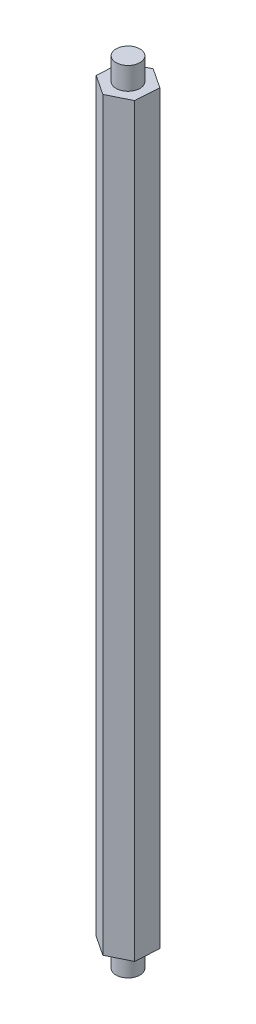
ISO-10303-21;
HEADER;
FILE_DESCRIPTION(('STEP AP214'),'2;1');
FILE_NAME('part.step','',(''),(''),'','','');
FILE_SCHEMA(('AUTOMOTIVE_DESIGN { 1 0 10303 214 1 1 1 1 }'));
ENDSEC;
DATA;
#1=APPLICATION_CONTEXT('core data for automotive mechanical design processes');
#2=APPLICATION_PROTOCOL_DEFINITION('international standard','automotive_design',2000,#1);
#3=PRODUCT_CONTEXT('',#1,'mechanical');
#4=PRODUCT('Part','Part','',(#3));
#5=PRODUCT_RELATED_PRODUCT_CATEGORY('part','',(#4));
#6=PRODUCT_DEFINITION_FORMATION('','',#4);
#7=PRODUCT_DEFINITION_CONTEXT('part definition',#1,'design');
#8=PRODUCT_DEFINITION('design','',#6,#7);
#9=PRODUCT_DEFINITION_SHAPE('','',#8);
#10=(LENGTH_UNIT() NAMED_UNIT(*) SI_UNIT(.MILLI.,.METRE.));
#11=(NAMED_UNIT(*) PLANE_ANGLE_UNIT() SI_UNIT($,.RADIAN.));
#12=(NAMED_UNIT(*) SI_UNIT($,.STERADIAN.) SOLID_ANGLE_UNIT());
#13=UNCERTAINTY_MEASURE_WITH_UNIT(LENGTH_MEASURE(1.E-05),#10,'distance_accuracy_value','');
#14=(GEOMETRIC_REPRESENTATION_CONTEXT(3) GLOBAL_UNCERTAINTY_ASSIGNED_CONTEXT((#13)) GLOBAL_UNIT_ASSIGNED_CONTEXT((#10,
#11,#12)) REPRESENTATION_CONTEXT('',''));
#15=CARTESIAN_POINT('',(0.,0.,0.));
#16=DIRECTION('',(0.,0.,1.));
#17=DIRECTION('',(1.,0.,0.));
#18=AXIS2_PLACEMENT_3D('',#15,#16,#17);
#19=CARTESIAN_POINT('',(0.,3.,0.));
#20=DIRECTION('',(0.,-1.,0.));
#21=DIRECTION('',(0.,0.,-1.));
#22=AXIS2_PLACEMENT_3D('',#19,#20,#21);
#23=CYLINDRICAL_SURFACE('',#22,1.6);
#24=CARTESIAN_POINT('',(0.,3.,0.));
#25=DIRECTION('',(0.,1.,0.));
#26=DIRECTION('',(0.,0.,1.));
#27=AXIS2_PLACEMENT_3D('',#24,#25,#26);
#28=CIRCLE('',#27,1.6);
#29=CARTESIAN_POINT('',(0.,3.,1.6));
#30=VERTEX_POINT('',#29);
#31=EDGE_CURVE('E53',#30,#30,#28,.T.);
#32=ORIENTED_EDGE('',*,*,#31,.F.);
#33=EDGE_LOOP('',(#32));
#34=FACE_BOUND('',#33,.T.);
#35=CARTESIAN_POINT('',(0.,0.,0.));
#36=DIRECTION('',(0.,1.,0.));
#37=DIRECTION('',(0.,0.,1.));
#38=AXIS2_PLACEMENT_3D('',#35,#36,#37);
#39=CIRCLE('',#38,1.6);
#40=CARTESIAN_POINT('',(0.,0.,1.6));
#41=VERTEX_POINT('',#40);
#42=EDGE_CURVE('E46',#41,#41,#39,.T.);
#43=ORIENTED_EDGE('',*,*,#42,.T.);
#44=EDGE_LOOP('',(#43));
#45=FACE_BOUND('',#44,.T.);
#46=ADVANCED_FACE('F43',(#34,#45),#23,.T.);
#47=CARTESIAN_POINT('',(0.,0.,0.));
#48=DIRECTION('',(0.,1.,0.));
#49=DIRECTION('',(0.,0.,1.));
#50=AXIS2_PLACEMENT_3D('',#47,#48,#49);
#51=PLANE('',#50);
#52=ORIENTED_EDGE('',*,*,#42,.F.);
#53=EDGE_LOOP('',(#52));
#54=FACE_BOUND('',#53,.T.);
#55=ADVANCED_FACE('F174',(#54),#51,.F.);
#56=CARTESIAN_POINT('',(-0.199155377241546,103.,3.17790120173107));
#57=DIRECTION('',(-0.44485449277717,0.,-0.895602858557278));
#58=DIRECTION('',(-0.895602858557278,0.,0.44485449277717));
#59=AXIS2_PLACEMENT_3D('',#56,#57,#58);
#60=PLANE('',#59);
#61=DIRECTION('',(0.895602858557278,0.,-0.44485449277717));
#62=VECTOR('',#61,1.);
#63=CARTESIAN_POINT('',(-0.199155377241546,3.,3.17790120173107));
#64=LINE('',#63,#62);
#65=CARTESIAN_POINT('',(-0.199155377241546,3.,3.17790120173107));
#66=VERTEX_POINT('',#65);
#67=CARTESIAN_POINT('',(2.65256548279543,3.,1.76142421685699));
#68=VERTEX_POINT('',#67);
#69=EDGE_CURVE('E135',#66,#68,#64,.T.);
#70=ORIENTED_EDGE('',*,*,#69,.T.);
#71=DIRECTION('',(0.,-1.,0.));
#72=VECTOR('',#71,1.);
#73=CARTESIAN_POINT('',(2.65256548279543,103.,1.76142421685699));
#74=LINE('',#73,#72);
#75=CARTESIAN_POINT('',(2.65256548279543,103.,1.76142421685699));
#76=VERTEX_POINT('',#75);
#77=EDGE_CURVE('E163',#76,#68,#74,.T.);
#78=ORIENTED_EDGE('',*,*,#77,.F.);
#79=DIRECTION('',(0.895602858557278,0.,-0.44485449277717));
#80=VECTOR('',#79,1.);
#81=CARTESIAN_POINT('',(-0.199155377241546,103.,3.17790120173107));
#82=LINE('',#81,#80);
#83=CARTESIAN_POINT('',(-0.199155377241546,103.,3.17790120173107));
#84=VERTEX_POINT('',#83);
#85=EDGE_CURVE('E152',#84,#76,#82,.T.);
#86=ORIENTED_EDGE('',*,*,#85,.F.);
#87=DIRECTION('',(0.,-1.,0.));
#88=VECTOR('',#87,1.);
#89=CARTESIAN_POINT('',(-0.199155377241546,103.,3.17790120173107));
#90=LINE('',#89,#88);
#91=EDGE_CURVE('E131',#84,#66,#90,.T.);
#92=ORIENTED_EDGE('',*,*,#91,.T.);
#93=EDGE_LOOP('',(#70,#78,#86,#92));
#94=FACE_BOUND('',#93,.T.);
#95=ADVANCED_FACE('F176',(#94),#60,.F.);
#96=CARTESIAN_POINT('',(2.65256548279543,103.,1.76142421685699));
#97=DIRECTION('',(-0.998042073601149,0.,-0.062546137545969));
#98=DIRECTION('',(-0.062546137545969,0.,0.998042073601149));
#99=AXIS2_PLACEMENT_3D('',#96,#97,#98);
#100=PLANE('',#99);
#101=DIRECTION('',(0.062546137545969,0.,-0.998042073601149));
#102=VECTOR('',#101,1.);
#103=CARTESIAN_POINT('',(2.65256548279543,3.,1.76142421685699));
#104=LINE('',#103,#102);
#105=CARTESIAN_POINT('',(2.85172086003698,3.,-1.41647698487408));
#106=VERTEX_POINT('',#105);
#107=EDGE_CURVE('E139',#68,#106,#104,.T.);
#108=ORIENTED_EDGE('',*,*,#107,.T.);
#109=DIRECTION('',(0.,-1.,0.));
#110=VECTOR('',#109,1.);
#111=CARTESIAN_POINT('',(2.85172086003698,103.,-1.41647698487408));
#112=LINE('',#111,#110);
#113=CARTESIAN_POINT('',(2.85172086003698,103.,-1.41647698487408));
#114=VERTEX_POINT('',#113);
#115=EDGE_CURVE('E159',#114,#106,#112,.T.);
#116=ORIENTED_EDGE('',*,*,#115,.F.);
#117=DIRECTION('',(0.062546137545969,0.,-0.998042073601149));
#118=VECTOR('',#117,1.);
#119=CARTESIAN_POINT('',(2.65256548279543,103.,1.76142421685699));
#120=LINE('',#119,#118);
#121=EDGE_CURVE('E100',#76,#114,#120,.T.);
#122=ORIENTED_EDGE('',*,*,#121,.F.);
#123=ORIENTED_EDGE('',*,*,#77,.T.);
#124=EDGE_LOOP('',(#108,#116,#122,#123));
#125=FACE_BOUND('',#124,.T.);
#126=ADVANCED_FACE('F181',(#125),#100,.F.);
#127=CARTESIAN_POINT('',(2.85172086003698,103.,-1.41647698487408));
#128=DIRECTION('',(-0.553187580823979,0.,0.833056721011309));
#129=DIRECTION('',(0.833056721011309,0.,0.553187580823979));
#130=AXIS2_PLACEMENT_3D('',#127,#128,#129);
#131=PLANE('',#130);
#132=DIRECTION('',(-0.833056721011309,0.,-0.553187580823979));
#133=VECTOR('',#132,1.);
#134=CARTESIAN_POINT('',(2.85172086003698,3.,-1.41647698487408));
#135=LINE('',#134,#133);
#136=CARTESIAN_POINT('',(0.199155377241546,3.,-3.17790120173107));
#137=VERTEX_POINT('',#136);
#138=EDGE_CURVE('E143',#106,#137,#135,.T.);
#139=ORIENTED_EDGE('',*,*,#138,.T.);
#140=DIRECTION('',(0.,-1.,0.));
#141=VECTOR('',#140,1.);
#142=CARTESIAN_POINT('',(0.199155377241546,103.,-3.17790120173107));
#143=LINE('',#142,#141);
#144=CARTESIAN_POINT('',(0.199155377241546,103.,-3.17790120173107));
#145=VERTEX_POINT('',#144);
#146=EDGE_CURVE('E124',#145,#137,#143,.T.);
#147=ORIENTED_EDGE('',*,*,#146,.F.);
#148=DIRECTION('',(-0.833056721011309,0.,-0.553187580823979));
#149=VECTOR('',#148,1.);
#150=CARTESIAN_POINT('',(2.85172086003698,103.,-1.41647698487408));
#151=LINE('',#150,#149);
#152=EDGE_CURVE('E113',#114,#145,#151,.T.);
#153=ORIENTED_EDGE('',*,*,#152,.F.);
#154=ORIENTED_EDGE('',*,*,#115,.T.);
#155=EDGE_LOOP('',(#139,#147,#153,#154));
#156=FACE_BOUND('',#155,.T.);
#157=ADVANCED_FACE('F188',(#156),#131,.F.);
#158=CARTESIAN_POINT('',(0.199155377241546,103.,-3.17790120173107));
#159=DIRECTION('',(0.444854492777169,0.,0.895602858557278));
#160=DIRECTION('',(0.895602858557278,0.,-0.444854492777169));
#161=AXIS2_PLACEMENT_3D('',#158,#159,#160);
#162=PLANE('',#161);
#163=DIRECTION('',(-0.895602858557278,0.,0.444854492777169));
#164=VECTOR('',#163,1.);
#165=CARTESIAN_POINT('',(0.199155377241546,3.,-3.17790120173107));
#166=LINE('',#165,#164);
#167=CARTESIAN_POINT('',(-2.65256548279543,3.,-1.76142421685699));
#168=VERTEX_POINT('',#167);
#169=EDGE_CURVE('E122',#137,#168,#166,.T.);
#170=ORIENTED_EDGE('',*,*,#169,.T.);
#171=DIRECTION('',(0.,-1.,0.));
#172=VECTOR('',#171,1.);
#173=CARTESIAN_POINT('',(-2.65256548279543,103.,-1.76142421685699));
#174=LINE('',#173,#172);
#175=CARTESIAN_POINT('',(-2.65256548279543,103.,-1.76142421685699));
#176=VERTEX_POINT('',#175);
#177=EDGE_CURVE('E119',#176,#168,#174,.T.);
#178=ORIENTED_EDGE('',*,*,#177,.F.);
#179=DIRECTION('',(-0.895602858557278,0.,0.444854492777169));
#180=VECTOR('',#179,1.);
#181=CARTESIAN_POINT('',(0.199155377241546,103.,-3.17790120173107));
#182=LINE('',#181,#180);
#183=EDGE_CURVE('E107',#145,#176,#182,.T.);
#184=ORIENTED_EDGE('',*,*,#183,.F.);
#185=ORIENTED_EDGE('',*,*,#146,.T.);
#186=EDGE_LOOP('',(#170,#178,#184,#185));
#187=FACE_BOUND('',#186,.T.);
#188=ADVANCED_FACE('F120',(#187),#162,.F.);
#189=CARTESIAN_POINT('',(-2.65256548279543,103.,-1.76142421685699));
#190=DIRECTION('',(0.998042073601149,0.,0.0625461375459693));
#191=DIRECTION('',(0.0625461375459693,0.,-0.998042073601149));
#192=AXIS2_PLACEMENT_3D('',#189,#190,#191);
#193=PLANE('',#192);
#194=DIRECTION('',(-0.0625461375459693,0.,0.998042073601149));
#195=VECTOR('',#194,1.);
#196=CARTESIAN_POINT('',(-2.65256548279543,3.,-1.76142421685699));
#197=LINE('',#196,#195);
#198=CARTESIAN_POINT('',(-2.85172086003698,3.,1.41647698487408));
#199=VERTEX_POINT('',#198);
#200=EDGE_CURVE('E85',#168,#199,#197,.T.);
#201=ORIENTED_EDGE('',*,*,#200,.T.);
#202=DIRECTION('',(0.,-1.,0.));
#203=VECTOR('',#202,1.);
#204=CARTESIAN_POINT('',(-2.85172086003698,103.,1.41647698487408));
#205=LINE('',#204,#203);
#206=CARTESIAN_POINT('',(-2.85172086003698,103.,1.41647698487408));
#207=VERTEX_POINT('',#206);
#208=EDGE_CURVE('E125',#207,#199,#205,.T.);
#209=ORIENTED_EDGE('',*,*,#208,.F.);
#210=DIRECTION('',(-0.0625461375459693,0.,0.998042073601149));
#211=VECTOR('',#210,1.);
#212=CARTESIAN_POINT('',(-2.65256548279543,103.,-1.76142421685699));
#213=LINE('',#212,#211);
#214=EDGE_CURVE('E111',#176,#207,#213,.T.);
#215=ORIENTED_EDGE('',*,*,#214,.F.);
#216=ORIENTED_EDGE('',*,*,#177,.T.);
#217=EDGE_LOOP('',(#201,#209,#215,#216));
#218=FACE_BOUND('',#217,.T.);
#219=ADVANCED_FACE('F127',(#218),#193,.F.);
#220=CARTESIAN_POINT('',(-2.85172086003698,103.,1.41647698487408));
#221=DIRECTION('',(0.553187580823979,0.,-0.833056721011309));
#222=DIRECTION('',(-0.833056721011309,0.,-0.553187580823979));
#223=AXIS2_PLACEMENT_3D('',#220,#221,#222);
#224=PLANE('',#223);
#225=DIRECTION('',(0.833056721011309,0.,0.553187580823979));
#226=VECTOR('',#225,1.);
#227=CARTESIAN_POINT('',(-2.85172086003698,3.,1.41647698487408));
#228=LINE('',#227,#226);
#229=EDGE_CURVE('E91',#199,#66,#228,.T.);
#230=ORIENTED_EDGE('',*,*,#229,.T.);
#231=ORIENTED_EDGE('',*,*,#91,.F.);
#232=DIRECTION('',(0.833056721011309,0.,0.553187580823979));
#233=VECTOR('',#232,1.);
#234=CARTESIAN_POINT('',(-2.85172086003698,103.,1.41647698487408));
#235=LINE('',#234,#233);
#236=EDGE_CURVE('E62',#207,#84,#235,.T.);
#237=ORIENTED_EDGE('',*,*,#236,.F.);
#238=ORIENTED_EDGE('',*,*,#208,.T.);
#239=EDGE_LOOP('',(#230,#231,#237,#238));
#240=FACE_BOUND('',#239,.T.);
#241=ADVANCED_FACE('F196',(#240),#224,.F.);
#242=CARTESIAN_POINT('',(0.,103.,0.));
#243=DIRECTION('',(0.,1.,0.));
#244=DIRECTION('',(0.,0.,1.));
#245=AXIS2_PLACEMENT_3D('',#242,#243,#244);
#246=PLANE('',#245);
#247=CARTESIAN_POINT('',(0.,103.,0.));
#248=DIRECTION('',(0.,1.,0.));
#249=DIRECTION('',(0.,0.,1.));
#250=AXIS2_PLACEMENT_3D('',#247,#248,#249);
#251=CIRCLE('',#250,1.6);
#252=CARTESIAN_POINT('',(0.,103.,1.6));
#253=VERTEX_POINT('',#252);
#254=EDGE_CURVE('E11',#253,#253,#251,.T.);
#255=ORIENTED_EDGE('',*,*,#254,.F.);
#256=EDGE_LOOP('',(#255));
#257=FACE_BOUND('',#256,.T.);
#258=ORIENTED_EDGE('',*,*,#85,.T.);
#259=ORIENTED_EDGE('',*,*,#121,.T.);
#260=ORIENTED_EDGE('',*,*,#152,.T.);
#261=ORIENTED_EDGE('',*,*,#183,.T.);
#262=ORIENTED_EDGE('',*,*,#214,.T.);
#263=ORIENTED_EDGE('',*,*,#236,.T.);
#264=EDGE_LOOP('',(#258,#259,#260,#261,#262,#263));
#265=FACE_BOUND('',#264,.T.);
#266=ADVANCED_FACE('F109',(#257,#265),#246,.T.);
#267=CARTESIAN_POINT('',(0.,3.,0.));
#268=DIRECTION('',(0.,1.,0.));
#269=DIRECTION('',(0.,0.,1.));
#270=AXIS2_PLACEMENT_3D('',#267,#268,#269);
#271=PLANE('',#270);
#272=ORIENTED_EDGE('',*,*,#31,.T.);
#273=EDGE_LOOP('',(#272));
#274=FACE_BOUND('',#273,.T.);
#275=ORIENTED_EDGE('',*,*,#69,.F.);
#276=ORIENTED_EDGE('',*,*,#229,.F.);
#277=ORIENTED_EDGE('',*,*,#200,.F.);
#278=ORIENTED_EDGE('',*,*,#169,.F.);
#279=ORIENTED_EDGE('',*,*,#138,.F.);
#280=ORIENTED_EDGE('',*,*,#107,.F.);
#281=EDGE_LOOP('',(#275,#276,#277,#278,#279,#280));
#282=FACE_BOUND('',#281,.T.);
#283=ADVANCED_FACE('F199',(#274,#282),#271,.F.);
#284=CARTESIAN_POINT('',(0.,106.,0.));
#285=DIRECTION('',(0.,-1.,0.));
#286=DIRECTION('',(0.,0.,-1.));
#287=AXIS2_PLACEMENT_3D('',#284,#285,#286);
#288=CYLINDRICAL_SURFACE('',#287,1.6);
#289=CARTESIAN_POINT('',(0.,106.,0.));
#290=DIRECTION('',(0.,1.,0.));
#291=DIRECTION('',(0.,0.,1.));
#292=AXIS2_PLACEMENT_3D('',#289,#290,#291);
#293=CIRCLE('',#292,1.6);
#294=CARTESIAN_POINT('',(0.,106.,1.6));
#295=VERTEX_POINT('',#294);
#296=EDGE_CURVE('E140',#295,#295,#293,.T.);
#297=ORIENTED_EDGE('',*,*,#296,.F.);
#298=EDGE_LOOP('',(#297));
#299=FACE_BOUND('',#298,.T.);
#300=ORIENTED_EDGE('',*,*,#254,.T.);
#301=EDGE_LOOP('',(#300));
#302=FACE_BOUND('',#301,.T.);
#303=ADVANCED_FACE('F202',(#299,#302),#288,.T.);
#304=CARTESIAN_POINT('',(0.,106.,0.));
#305=DIRECTION('',(0.,1.,0.));
#306=DIRECTION('',(0.,0.,1.));
#307=AXIS2_PLACEMENT_3D('',#304,#305,#306);
#308=PLANE('',#307);
#309=ORIENTED_EDGE('',*,*,#296,.T.);
#310=EDGE_LOOP('',(#309));
#311=FACE_BOUND('',#310,.T.);
#312=ADVANCED_FACE('F208',(#311),#308,.T.);
#313=CLOSED_SHELL('',(#46,#55,#95,#126,#157,#188,#219,#241,#266,#283,#303,#312));
#314=MANIFOLD_SOLID_BREP('B2',#313);
#315=ADVANCED_BREP_SHAPE_REPRESENTATION('',(#18,#314),#14);
#316=SHAPE_DEFINITION_REPRESENTATION(#9,#315);
ENDSEC;
END-ISO-10303-21;
